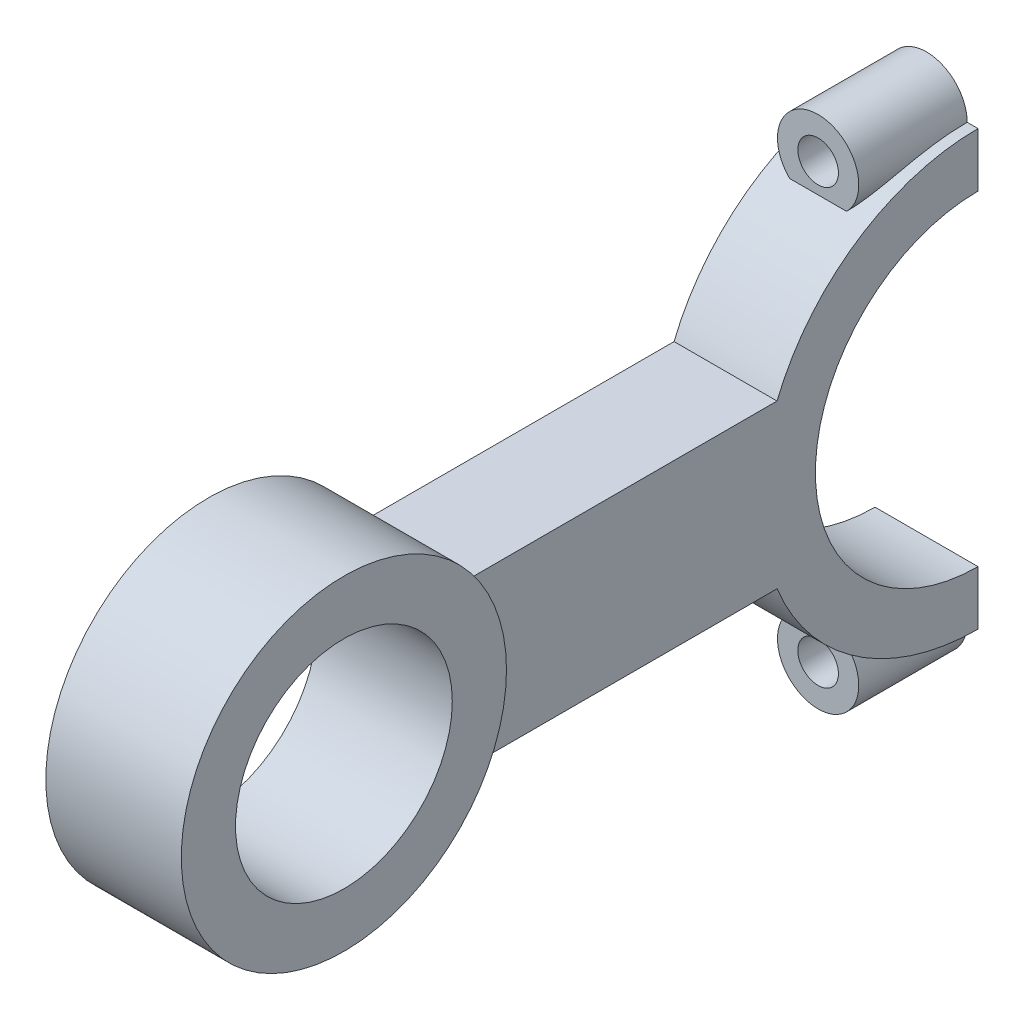
ISO-10303-21;
HEADER;
FILE_DESCRIPTION(('STEP AP214'),'2;1');
FILE_NAME('part.step','',(''),(''),'','','');
FILE_SCHEMA(('AUTOMOTIVE_DESIGN { 1 0 10303 214 1 1 1 1 }'));
ENDSEC;
DATA;
#1=APPLICATION_CONTEXT('core data for automotive mechanical design processes');
#2=APPLICATION_PROTOCOL_DEFINITION('international standard','automotive_design',2000,#1);
#3=PRODUCT_CONTEXT('',#1,'mechanical');
#4=PRODUCT('Part','Part','',(#3));
#5=PRODUCT_RELATED_PRODUCT_CATEGORY('part','',(#4));
#6=PRODUCT_DEFINITION_FORMATION('','',#4);
#7=PRODUCT_DEFINITION_CONTEXT('part definition',#1,'design');
#8=PRODUCT_DEFINITION('design','',#6,#7);
#9=PRODUCT_DEFINITION_SHAPE('','',#8);
#10=(LENGTH_UNIT() NAMED_UNIT(*) SI_UNIT(.MILLI.,.METRE.));
#11=(NAMED_UNIT(*) PLANE_ANGLE_UNIT() SI_UNIT($,.RADIAN.));
#12=(NAMED_UNIT(*) SI_UNIT($,.STERADIAN.) SOLID_ANGLE_UNIT());
#13=UNCERTAINTY_MEASURE_WITH_UNIT(LENGTH_MEASURE(1.E-05),#10,'distance_accuracy_value','');
#14=(GEOMETRIC_REPRESENTATION_CONTEXT(3) GLOBAL_UNCERTAINTY_ASSIGNED_CONTEXT((#13)) GLOBAL_UNIT_ASSIGNED_CONTEXT((#10,
#11,#12)) REPRESENTATION_CONTEXT('',''));
#15=CARTESIAN_POINT('',(0.,0.,0.));
#16=DIRECTION('',(0.,0.,1.));
#17=DIRECTION('',(1.,0.,0.));
#18=AXIS2_PLACEMENT_3D('',#15,#16,#17);
#19=CARTESIAN_POINT('',(-12.065,0.,-76.2));
#20=DIRECTION('',(1.,0.,0.));
#21=DIRECTION('',(0.,0.,-1.));
#22=AXIS2_PLACEMENT_3D('',#19,#20,#21);
#23=CYLINDRICAL_SURFACE('',#22,50.8);
#24=DIRECTION('',(1.,0.,0.));
#25=VECTOR('',#24,1.);
#26=CARTESIAN_POINT('',(-12.065,43.9940905122495,-50.8));
#27=LINE('',#26,#25);
#28=CARTESIAN_POINT('',(6.6637242623437,43.9940905122495,-50.8));
#29=VERTEX_POINT('',#28);
#30=CARTESIAN_POINT('',(-6.6637242623437,43.9940905122495,-50.8));
#31=VERTEX_POINT('',#30);
#32=EDGE_CURVE('E12',#29,#31,#27,.F.);
#33=ORIENTED_EDGE('',*,*,#32,.T.);
#34=CARTESIAN_POINT('',(-6.66372426234371,43.9940905122495,-50.8));
#35=CARTESIAN_POINT('',(-6.78714507767568,44.1149745167094,-51.0093556828712));
#36=CARTESIAN_POINT('',(-6.90404502912758,44.2359679779256,-51.2223943921369));
#37=CARTESIAN_POINT('',(-7.1257852077379,44.4773581537205,-51.6548253243804));
#38=CARTESIAN_POINT('',(-7.23063168210203,44.5977551461968,-51.8742141816521));
#39=CARTESIAN_POINT('',(-7.42910931867264,44.8369460844653,-52.3179626378349));
#40=CARTESIAN_POINT('',(-7.5227695305004,44.9557434387529,-52.5423074860222));
#41=CARTESIAN_POINT('',(-7.70014774552419,45.1915149853282,-52.9958551766107));
#42=CARTESIAN_POINT('',(-7.78386430115753,45.3084889100193,-53.2250587206143));
#43=CARTESIAN_POINT('',(-8.0197946567612,45.6535654213124,-53.9142680776743));
#44=CARTESIAN_POINT('',(-8.15881023504244,45.8783260879772,-54.3805063602118));
#45=CARTESIAN_POINT('',(-8.40748586818554,46.3163385454464,-55.326358197645));
#46=CARTESIAN_POINT('',(-8.51712016710643,46.5295801086097,-55.8059830834195));
#47=CARTESIAN_POINT('',(-8.70745871757883,46.933067806619,-56.7531579241606));
#48=CARTESIAN_POINT('',(-8.789273236757,47.1239224957273,-57.2202286793852));
#49=CARTESIAN_POINT('',(-8.93451213982036,47.4925302736367,-58.1623853328301));
#50=CARTESIAN_POINT('',(-8.99793316349758,47.6702809641214,-58.6374726788042));
#51=CARTESIAN_POINT('',(-9.10962499168931,48.0120473917557,-59.5945300060164));
#52=CARTESIAN_POINT('',(-9.15788910041945,48.1760570352086,-60.076502931038));
#53=CARTESIAN_POINT('',(-9.24201704965379,48.4897810633318,-61.0460971657501));
#54=CARTESIAN_POINT('',(-9.27788159984937,48.6394962657922,-61.5337181505212));
#55=CARTESIAN_POINT('',(-9.33988927945831,48.9255181182804,-62.5179487961996));
#56=CARTESIAN_POINT('',(-9.36594796003964,49.0617011741072,-63.0145995750742));
#57=CARTESIAN_POINT('',(-9.41005995898977,49.3189779931191,-64.012147448693));
#58=CARTESIAN_POINT('',(-9.42811310074599,49.4400714233651,-64.5130446368702));
#59=CARTESIAN_POINT('',(-9.45806110305791,49.6669536523306,-65.518281270121));
#60=CARTESIAN_POINT('',(-9.4699581746091,49.772747935995,-66.0226194133219));
#61=CARTESIAN_POINT('',(-9.48918789388723,49.9689516699838,-67.0343363663388));
#62=CARTESIAN_POINT('',(-9.49652071656466,50.0593617098991,-67.5417150588559));
#63=CARTESIAN_POINT('',(-9.50986522006271,50.2520071997592,-68.727004422185));
#64=CARTESIAN_POINT('',(-9.51464110339692,50.348289468525,-69.4059030482798));
#65=CARTESIAN_POINT('',(-9.52104209639243,50.5132898404504,-70.7670032944107));
#66=CARTESIAN_POINT('',(-9.52266748104739,50.5820103489437,-71.4492046209566));
#67=CARTESIAN_POINT('',(-9.52406672643117,50.6640654462971,-72.4707061876681));
#68=CARTESIAN_POINT('',(-9.52436109091229,50.6878446177566,-72.8091965604011));
#69=CARTESIAN_POINT('',(-9.52475472761422,50.7286164699485,-73.4865901040368));
#70=CARTESIAN_POINT('',(-9.52485400035419,50.7456091687403,-73.8254932738385));
#71=CARTESIAN_POINT('',(-9.52497127884611,50.772801367115,-74.5035950009892));
#72=CARTESIAN_POINT('',(-9.52498927879361,50.7830003814541,-74.8427935777055));
#73=CARTESIAN_POINT('',(-9.52499979869331,50.7965999258104,-75.5213278855254));
#74=CARTESIAN_POINT('',(-9.52499231857819,50.8000004378674,-75.8606636169888));
#75=CARTESIAN_POINT('',(-9.525,50.8,-76.2));
#76=B_SPLINE_CURVE_WITH_KNOTS('',3,(#34,#35,#36,#37,#38,#39,#40,#41,#42,#43,#44,#45,#46,#47,#48,
#49,#50,#51,#52,#53,#54,#55,#56,#57,#58,#59,#60,#61,#62,#63,#64,#65,#66,#67,#68,#69,#70,#71,#72,
#73,#74,#75),.UNSPECIFIED.,.F.,.F.,(4,2,2,2,2,2,2,2,2,2,2,2,2,2,2,2,2,2,2,2,4),(0.,
0.814083169141417,1.62774248594388,2.43924061867581,3.25085674205193,4.85721211195251,
6.46497105778604,7.99779083240933,9.53089045343451,11.064666393555,12.5983545331443,
14.144964021117,15.6916076276054,17.2376953600322,18.7837238263056,20.8402618857306,
22.8966204306049,23.9145385695206,24.9324539996777,25.9504421273934,26.9684329444187),.UNSPECIFIED.);
#77=CARTESIAN_POINT('',(-9.525,50.8,-76.2));
#78=VERTEX_POINT('',#77);
#79=EDGE_CURVE('E136',#31,#78,#76,.T.);
#80=ORIENTED_EDGE('',*,*,#79,.T.);
#81=DIRECTION('',(1.,0.,0.));
#82=VECTOR('',#81,1.);
#83=CARTESIAN_POINT('',(-12.065,50.8,-76.2));
#84=LINE('',#83,#82);
#85=CARTESIAN_POINT('',(-12.065,50.8,-76.2));
#86=VERTEX_POINT('',#85);
#87=EDGE_CURVE('E321',#86,#78,#84,.T.);
#88=ORIENTED_EDGE('',*,*,#87,.F.);
#89=CARTESIAN_POINT('',(-12.065,0.,-76.2));
#90=DIRECTION('',(1.,0.,0.));
#91=DIRECTION('',(0.,0.,-1.));
#92=AXIS2_PLACEMENT_3D('',#89,#90,#91);
#93=CIRCLE('',#92,50.8);
#94=CARTESIAN_POINT('',(-12.065,19.05,-29.1071396069425));
#95=VERTEX_POINT('',#94);
#96=EDGE_CURVE('E289',#86,#95,#93,.T.);
#97=ORIENTED_EDGE('',*,*,#96,.T.);
#98=DIRECTION('',(1.,0.,0.));
#99=VECTOR('',#98,1.);
#100=CARTESIAN_POINT('',(-12.065,19.05,-29.1071396069425));
#101=LINE('',#100,#99);
#102=CARTESIAN_POINT('',(12.065,19.05,-29.1071396069425));
#103=VERTEX_POINT('',#102);
#104=EDGE_CURVE('E319',#95,#103,#101,.T.);
#105=ORIENTED_EDGE('',*,*,#104,.T.);
#106=CARTESIAN_POINT('',(12.065,0.,-76.2));
#107=DIRECTION('',(1.,0.,0.));
#108=DIRECTION('',(0.,0.,-1.));
#109=AXIS2_PLACEMENT_3D('',#106,#107,#108);
#110=CIRCLE('',#109,50.8);
#111=CARTESIAN_POINT('',(12.065,50.8,-76.2));
#112=VERTEX_POINT('',#111);
#113=EDGE_CURVE('E310',#112,#103,#110,.T.);
#114=ORIENTED_EDGE('',*,*,#113,.F.);
#115=CARTESIAN_POINT('',(9.52499999999999,50.8,-76.2));
#116=VERTEX_POINT('',#115);
#117=EDGE_CURVE('E150',#116,#112,#84,.T.);
#118=ORIENTED_EDGE('',*,*,#117,.F.);
#119=CARTESIAN_POINT('',(9.52499999999999,50.8,-76.2));
#120=CARTESIAN_POINT('',(9.5249914548326,50.8000004824258,-75.8514595626229));
#121=CARTESIAN_POINT('',(9.52499977792267,50.7964129772817,-75.50291986414));
#122=CARTESIAN_POINT('',(9.52498806551663,50.7820657728827,-74.8059907540749));
#123=CARTESIAN_POINT('',(9.52496803023518,50.771306127919,-74.4576013413752));
#124=CARTESIAN_POINT('',(9.52483750609108,50.7426180633056,-73.761107554386));
#125=CARTESIAN_POINT('',(9.52472701494879,50.724689462993,-73.4130031875015));
#126=CARTESIAN_POINT('',(9.52428881618815,50.6816720466165,-72.7172404071366));
#127=CARTESIAN_POINT('',(9.52396110690317,50.6565831756156,-72.3695819970984));
#128=CARTESIAN_POINT('',(9.52241144807626,50.5704422013308,-71.3257071400585));
#129=CARTESIAN_POINT('',(9.5206217707491,50.4985881058789,-70.6303497570593));
#130=CARTESIAN_POINT('',(9.51360088435099,50.326255188909,-69.2432391615338));
#131=CARTESIAN_POINT('',(9.50836971955042,50.2257767356166,-68.5514859027603));
#132=CARTESIAN_POINT('',(9.49144029038421,49.9922905515643,-67.1482265243227));
#133=CARTESIAN_POINT('',(9.47951845487131,49.8582522367645,-66.4368937685383));
#134=CARTESIAN_POINT('',(9.44513023053024,49.5599658918375,-65.0208545823479));
#135=CARTESIAN_POINT('',(9.42266418119162,49.3957188344377,-64.3161479393475));
#136=CARTESIAN_POINT('',(9.3623092869805,49.037694390344,-62.915952622556));
#137=CARTESIAN_POINT('',(9.32444204523951,48.8439586044837,-62.2204524401887));
#138=CARTESIAN_POINT('',(9.22728079118382,48.4275220428352,-60.8398295528884));
#139=CARTESIAN_POINT('',(9.16799212777738,48.2048285066468,-60.1547043018025));
#140=CARTESIAN_POINT('',(9.02510667092575,47.745934723844,-58.8385151553116));
#141=CARTESIAN_POINT('',(8.94321096947782,47.5113840419628,-58.2067007028179));
#142=CARTESIAN_POINT('',(8.79568070367291,47.1422542834185,-57.2695801645589));
#143=CARTESIAN_POINT('',(8.74237368582689,47.0162946605612,-56.9588999798175));
#144=CARTESIAN_POINT('',(8.62641533591693,46.7588942926624,-56.3415611892948));
#145=CARTESIAN_POINT('',(8.56376407462319,46.6274535891383,-56.0349025530747));
#146=CARTESIAN_POINT('',(8.42870449128087,46.3610125647959,-55.4297193846938));
#147=CARTESIAN_POINT('',(8.35641807623656,46.226071396028,-55.1311417343201));
#148=CARTESIAN_POINT('',(8.20023603813151,45.9516303419619,-54.5391109893381));
#149=CARTESIAN_POINT('',(8.1163395324352,45.8121301106858,-54.2456582862565));
#150=CARTESIAN_POINT('',(7.93559338158615,45.529314934328,-53.6650124612053));
#151=CARTESIAN_POINT('',(7.83875676593935,45.3860039411109,-53.3778133763629));
#152=CARTESIAN_POINT('',(7.63049223891868,45.0962249143271,-52.8104320433214));
#153=CARTESIAN_POINT('',(7.51906846315709,44.9497577853532,-52.5302478330517));
#154=CARTESIAN_POINT('',(7.34543764390407,44.7355526177639,-52.1294709500981));
#155=CARTESIAN_POINT('',(7.28973037847408,44.6686664087043,-52.0055818586762));
#156=CARTESIAN_POINT('',(7.17480563556864,44.5345720021468,-51.7596337065241));
#157=CARTESIAN_POINT('',(7.11558854012569,44.4673638404216,-51.6375744484285));
#158=CARTESIAN_POINT('',(6.9932430103707,44.3325044255268,-51.3949930059154));
#159=CARTESIAN_POINT('',(6.93010130788377,44.264852447728,-51.2744779055503));
#160=CARTESIAN_POINT('',(6.79989782904159,44.1294812042795,-51.0355851985909));
#161=CARTESIAN_POINT('',(6.73283526957157,44.0617619278614,-50.9172080252282));
#162=CARTESIAN_POINT('',(6.6637242623437,43.9940905122495,-50.8));
#163=B_SPLINE_CURVE_WITH_KNOTS('',3,(#119,#120,#121,#122,#123,#124,#125,#126,#127,#128,#129,
#130,#131,#132,#133,#134,#135,#136,#137,#138,#139,#140,#141,#142,#143,#144,#145,#146,#147,#148,
#149,#150,#151,#152,#153,#154,#155,#156,#157,#158,#159,#160,#161,#162),.UNSPECIFIED.,.F.,.F.,(4,
2,2,2,2,2,2,2,2,2,2,2,2,2,2,2,2,2,2,2,2,4),(0.,1.04560138208973,2.09119484933769,
3.1368146679563,4.18244250928531,6.27897471061054,8.37547994323048,10.5466111894912,
12.7176725371477,14.8856989996193,17.0531844816865,19.0886125964924,20.1068171030802,
21.1250138985169,22.1313728448569,23.1378083398387,24.1432379769158,25.148383179003,
25.602577281186,26.0567220364261,26.5124958249545,26.9683609584797),.UNSPECIFIED.);
#164=EDGE_CURVE('E143',#116,#29,#163,.T.);
#165=ORIENTED_EDGE('',*,*,#164,.T.);
#166=EDGE_LOOP('',(#33,#80,#88,#97,#105,#114,#118,#165));
#167=FACE_BOUND('',#166,.T.);
#168=ADVANCED_FACE('F45',(#167),#23,.T.);
#169=CARTESIAN_POINT('',(-12.065,0.,0.));
#170=DIRECTION('',(1.,0.,0.));
#171=DIRECTION('',(0.,0.,-1.));
#172=AXIS2_PLACEMENT_3D('',#169,#170,#171);
#173=PLANE('',#172);
#174=CARTESIAN_POINT('',(-12.065,0.,76.2));
#175=DIRECTION('',(1.,0.,0.));
#176=DIRECTION('',(0.,0.,-1.));
#177=AXIS2_PLACEMENT_3D('',#174,#175,#176);
#178=CIRCLE('',#177,38.1);
#179=CARTESIAN_POINT('',(-12.065,19.05,43.2044321158129));
#180=VERTEX_POINT('',#179);
#181=CARTESIAN_POINT('',(-12.065,-19.05,43.2044321158129));
#182=VERTEX_POINT('',#181);
#183=EDGE_CURVE('E269',#180,#182,#178,.F.);
#184=ORIENTED_EDGE('',*,*,#183,.F.);
#185=DIRECTION('',(0.,0.,1.));
#186=VECTOR('',#185,1.);
#187=CARTESIAN_POINT('',(-12.065,19.05,0.));
#188=LINE('',#187,#186);
#189=EDGE_CURVE('E292',#95,#180,#188,.T.);
#190=ORIENTED_EDGE('',*,*,#189,.F.);
#191=ORIENTED_EDGE('',*,*,#96,.F.);
#192=DIRECTION('',(0.,-1.,0.));
#193=VECTOR('',#192,1.);
#194=CARTESIAN_POINT('',(-12.065,0.,-76.2));
#195=LINE('',#194,#193);
#196=CARTESIAN_POINT('',(-12.065,38.1,-76.2));
#197=VERTEX_POINT('',#196);
#198=EDGE_CURVE('E286',#86,#197,#195,.T.);
#199=ORIENTED_EDGE('',*,*,#198,.T.);
#200=CARTESIAN_POINT('',(-12.065,0.,-76.2));
#201=DIRECTION('',(1.,0.,0.));
#202=DIRECTION('',(0.,0.,-1.));
#203=AXIS2_PLACEMENT_3D('',#200,#201,#202);
#204=CIRCLE('',#203,38.1);
#205=CARTESIAN_POINT('',(-12.065,-38.1,-76.2));
#206=VERTEX_POINT('',#205);
#207=EDGE_CURVE('E283',#197,#206,#204,.T.);
#208=ORIENTED_EDGE('',*,*,#207,.T.);
#209=DIRECTION('',(0.,-1.,0.));
#210=VECTOR('',#209,1.);
#211=CARTESIAN_POINT('',(-12.065,0.,-76.2));
#212=LINE('',#211,#210);
#213=CARTESIAN_POINT('',(-12.065,-50.8,-76.2));
#214=VERTEX_POINT('',#213);
#215=EDGE_CURVE('E281',#206,#214,#212,.T.);
#216=ORIENTED_EDGE('',*,*,#215,.T.);
#217=CARTESIAN_POINT('',(-12.065,0.,-76.2));
#218=DIRECTION('',(1.,0.,0.));
#219=DIRECTION('',(0.,0.,-1.));
#220=AXIS2_PLACEMENT_3D('',#217,#218,#219);
#221=CIRCLE('',#220,50.8);
#222=CARTESIAN_POINT('',(-12.065,-19.05,-29.1071396069426));
#223=VERTEX_POINT('',#222);
#224=EDGE_CURVE('E277',#223,#214,#221,.T.);
#225=ORIENTED_EDGE('',*,*,#224,.F.);
#226=DIRECTION('',(0.,0.,1.));
#227=VECTOR('',#226,1.);
#228=CARTESIAN_POINT('',(-12.065,-19.05,0.));
#229=LINE('',#228,#227);
#230=EDGE_CURVE('E274',#223,#182,#229,.T.);
#231=ORIENTED_EDGE('',*,*,#230,.T.);
#232=EDGE_LOOP('',(#184,#190,#191,#199,#208,#216,#225,#231));
#233=FACE_BOUND('',#232,.T.);
#234=ADVANCED_FACE('F226',(#233),#173,.F.);
#235=CARTESIAN_POINT('',(12.065,0.,0.));
#236=DIRECTION('',(1.,0.,0.));
#237=DIRECTION('',(0.,0.,-1.));
#238=AXIS2_PLACEMENT_3D('',#235,#236,#237);
#239=PLANE('',#238);
#240=DIRECTION('',(0.,0.,1.));
#241=VECTOR('',#240,1.);
#242=CARTESIAN_POINT('',(12.065,19.05,0.));
#243=LINE('',#242,#241);
#244=CARTESIAN_POINT('',(12.065,19.05,43.2044321158129));
#245=VERTEX_POINT('',#244);
#246=EDGE_CURVE('E278',#103,#245,#243,.T.);
#247=ORIENTED_EDGE('',*,*,#246,.T.);
#248=CARTESIAN_POINT('',(12.065,0.,76.2));
#249=DIRECTION('',(1.,0.,0.));
#250=DIRECTION('',(0.,0.,-1.));
#251=AXIS2_PLACEMENT_3D('',#248,#249,#250);
#252=CIRCLE('',#251,38.1);
#253=CARTESIAN_POINT('',(12.065,-19.05,43.2044321158129));
#254=VERTEX_POINT('',#253);
#255=EDGE_CURVE('E318',#245,#254,#252,.F.);
#256=ORIENTED_EDGE('',*,*,#255,.T.);
#257=DIRECTION('',(0.,0.,1.));
#258=VECTOR('',#257,1.);
#259=CARTESIAN_POINT('',(12.065,-19.05,0.));
#260=LINE('',#259,#258);
#261=CARTESIAN_POINT('',(12.065,-19.05,-29.1071396069426));
#262=VERTEX_POINT('',#261);
#263=EDGE_CURVE('E273',#262,#254,#260,.T.);
#264=ORIENTED_EDGE('',*,*,#263,.F.);
#265=CARTESIAN_POINT('',(12.065,0.,-76.2));
#266=DIRECTION('',(1.,0.,0.));
#267=DIRECTION('',(0.,0.,-1.));
#268=AXIS2_PLACEMENT_3D('',#265,#266,#267);
#269=CIRCLE('',#268,50.8);
#270=CARTESIAN_POINT('',(12.065,-50.8,-76.2));
#271=VERTEX_POINT('',#270);
#272=EDGE_CURVE('E298',#262,#271,#269,.T.);
#273=ORIENTED_EDGE('',*,*,#272,.T.);
#274=DIRECTION('',(0.,-1.,0.));
#275=VECTOR('',#274,1.);
#276=CARTESIAN_POINT('',(12.065,0.,-76.2));
#277=LINE('',#276,#275);
#278=CARTESIAN_POINT('',(12.065,-38.1,-76.2));
#279=VERTEX_POINT('',#278);
#280=EDGE_CURVE('E301',#279,#271,#277,.T.);
#281=ORIENTED_EDGE('',*,*,#280,.F.);
#282=CARTESIAN_POINT('',(12.065,0.,-76.2));
#283=DIRECTION('',(1.,0.,0.));
#284=DIRECTION('',(0.,0.,-1.));
#285=AXIS2_PLACEMENT_3D('',#282,#283,#284);
#286=CIRCLE('',#285,38.1);
#287=CARTESIAN_POINT('',(12.065,38.1,-76.2));
#288=VERTEX_POINT('',#287);
#289=EDGE_CURVE('E304',#288,#279,#286,.T.);
#290=ORIENTED_EDGE('',*,*,#289,.F.);
#291=DIRECTION('',(0.,-1.,0.));
#292=VECTOR('',#291,1.);
#293=CARTESIAN_POINT('',(12.065,0.,-76.2));
#294=LINE('',#293,#292);
#295=EDGE_CURVE('E307',#112,#288,#294,.T.);
#296=ORIENTED_EDGE('',*,*,#295,.F.);
#297=ORIENTED_EDGE('',*,*,#113,.T.);
#298=EDGE_LOOP('',(#247,#256,#264,#273,#281,#290,#296,#297));
#299=FACE_BOUND('',#298,.T.);
#300=ADVANCED_FACE('F218',(#299),#239,.T.);
#301=CARTESIAN_POINT('',(-12.065,0.,76.2));
#302=DIRECTION('',(1.,0.,0.));
#303=DIRECTION('',(0.,0.,-1.));
#304=AXIS2_PLACEMENT_3D('',#301,#302,#303);
#305=CYLINDRICAL_SURFACE('',#304,38.1);
#306=DIRECTION('',(1.,0.,0.));
#307=VECTOR('',#306,1.);
#308=CARTESIAN_POINT('',(-12.065,-19.05,43.2044321158129));
#309=LINE('',#308,#307);
#310=EDGE_CURVE('E295',#182,#254,#309,.T.);
#311=ORIENTED_EDGE('',*,*,#310,.T.);
#312=ORIENTED_EDGE('',*,*,#255,.F.);
#313=DIRECTION('',(1.,0.,0.));
#314=VECTOR('',#313,1.);
#315=CARTESIAN_POINT('',(-12.065,19.05,43.2044321158129));
#316=LINE('',#315,#314);
#317=EDGE_CURVE('E315',#180,#245,#316,.T.);
#318=ORIENTED_EDGE('',*,*,#317,.F.);
#319=ORIENTED_EDGE('',*,*,#183,.T.);
#320=EDGE_LOOP('',(#311,#312,#318,#319));
#321=FACE_BOUND('',#320,.T.);
#322=CARTESIAN_POINT('',(15.875,0.,76.2));
#323=DIRECTION('',(1.,0.,0.));
#324=DIRECTION('',(0.,0.,-1.));
#325=AXIS2_PLACEMENT_3D('',#322,#323,#324);
#326=CIRCLE('',#325,38.1);
#327=CARTESIAN_POINT('',(15.875,0.,38.1));
#328=VERTEX_POINT('',#327);
#329=EDGE_CURVE('E266',#328,#328,#326,.T.);
#330=ORIENTED_EDGE('',*,*,#329,.F.);
#331=EDGE_LOOP('',(#330));
#332=FACE_BOUND('',#331,.T.);
#333=CARTESIAN_POINT('',(-15.875,0.,76.2));
#334=DIRECTION('',(1.,0.,0.));
#335=DIRECTION('',(0.,0.,-1.));
#336=AXIS2_PLACEMENT_3D('',#333,#334,#335);
#337=CIRCLE('',#336,38.1);
#338=CARTESIAN_POINT('',(-15.875,0.,38.1));
#339=VERTEX_POINT('',#338);
#340=EDGE_CURVE('E251',#339,#339,#337,.T.);
#341=ORIENTED_EDGE('',*,*,#340,.T.);
#342=EDGE_LOOP('',(#341));
#343=FACE_BOUND('',#342,.T.);
#344=ADVANCED_FACE('F215',(#321,#332,#343),#305,.T.);
#345=CARTESIAN_POINT('',(-12.065,19.05,0.));
#346=DIRECTION('',(0.,1.,0.));
#347=DIRECTION('',(0.,0.,1.));
#348=AXIS2_PLACEMENT_3D('',#345,#346,#347);
#349=PLANE('',#348);
#350=ORIENTED_EDGE('',*,*,#246,.F.);
#351=ORIENTED_EDGE('',*,*,#104,.F.);
#352=ORIENTED_EDGE('',*,*,#189,.T.);
#353=ORIENTED_EDGE('',*,*,#317,.T.);
#354=EDGE_LOOP('',(#350,#351,#352,#353));
#355=FACE_BOUND('',#354,.T.);
#356=ADVANCED_FACE('F217',(#355),#349,.T.);
#357=CARTESIAN_POINT('',(-12.065,0.,-76.2));
#358=DIRECTION('',(0.,0.,1.));
#359=DIRECTION('',(1.,0.,0.));
#360=AXIS2_PLACEMENT_3D('',#357,#358,#359);
#361=PLANE('',#360);
#362=CARTESIAN_POINT('',(0.,50.8,-76.2));
#363=DIRECTION('',(0.,0.,1.));
#364=DIRECTION('',(-1.,0.,0.));
#365=AXIS2_PLACEMENT_3D('',#362,#363,#364);
#366=CIRCLE('',#365,4.76);
#367=CARTESIAN_POINT('',(-4.76,50.8,-76.2));
#368=VERTEX_POINT('',#367);
#369=EDGE_CURVE('E373',#368,#368,#366,.T.);
#370=ORIENTED_EDGE('',*,*,#369,.T.);
#371=EDGE_LOOP('',(#370));
#372=FACE_BOUND('',#371,.T.);
#373=ORIENTED_EDGE('',*,*,#87,.T.);
#374=CARTESIAN_POINT('',(0.,50.8,-76.2));
#375=DIRECTION('',(0.,0.,1.));
#376=DIRECTION('',(-1.,0.,0.));
#377=AXIS2_PLACEMENT_3D('',#374,#375,#376);
#378=CIRCLE('',#377,9.525);
#379=EDGE_CURVE('E61',#116,#78,#378,.T.);
#380=ORIENTED_EDGE('',*,*,#379,.F.);
#381=ORIENTED_EDGE('',*,*,#117,.T.);
#382=ORIENTED_EDGE('',*,*,#295,.T.);
#383=DIRECTION('',(1.,0.,0.));
#384=VECTOR('',#383,1.);
#385=CARTESIAN_POINT('',(-12.065,38.1,-76.2));
#386=LINE('',#385,#384);
#387=EDGE_CURVE('E323',#197,#288,#386,.T.);
#388=ORIENTED_EDGE('',*,*,#387,.F.);
#389=ORIENTED_EDGE('',*,*,#198,.F.);
#390=EDGE_LOOP('',(#373,#380,#381,#382,#388,#389));
#391=FACE_BOUND('',#390,.T.);
#392=ADVANCED_FACE('F224',(#372,#391),#361,.F.);
#393=CARTESIAN_POINT('',(-12.065,0.,-76.2));
#394=DIRECTION('',(1.,0.,0.));
#395=DIRECTION('',(0.,0.,-1.));
#396=AXIS2_PLACEMENT_3D('',#393,#394,#395);
#397=CYLINDRICAL_SURFACE('',#396,38.1);
#398=ORIENTED_EDGE('',*,*,#289,.T.);
#399=DIRECTION('',(1.,0.,0.));
#400=VECTOR('',#399,1.);
#401=CARTESIAN_POINT('',(-12.065,-38.1,-76.2));
#402=LINE('',#401,#400);
#403=EDGE_CURVE('E326',#206,#279,#402,.T.);
#404=ORIENTED_EDGE('',*,*,#403,.F.);
#405=ORIENTED_EDGE('',*,*,#207,.F.);
#406=ORIENTED_EDGE('',*,*,#387,.T.);
#407=EDGE_LOOP('',(#398,#404,#405,#406));
#408=FACE_BOUND('',#407,.T.);
#409=ADVANCED_FACE('F347',(#408),#397,.F.);
#410=CARTESIAN_POINT('',(-12.065,0.,-76.2));
#411=DIRECTION('',(0.,0.,1.));
#412=DIRECTION('',(1.,0.,0.));
#413=AXIS2_PLACEMENT_3D('',#410,#411,#412);
#414=PLANE('',#413);
#415=CARTESIAN_POINT('',(0.,-50.8,-76.2));
#416=DIRECTION('',(0.,0.,-1.));
#417=DIRECTION('',(-1.,0.,0.));
#418=AXIS2_PLACEMENT_3D('',#415,#416,#417);
#419=CIRCLE('',#418,4.76);
#420=CARTESIAN_POINT('',(-4.76,-50.8,-76.2));
#421=VERTEX_POINT('',#420);
#422=EDGE_CURVE('E142',#421,#421,#419,.T.);
#423=ORIENTED_EDGE('',*,*,#422,.F.);
#424=EDGE_LOOP('',(#423));
#425=FACE_BOUND('',#424,.T.);
#426=DIRECTION('',(1.,0.,0.));
#427=VECTOR('',#426,1.);
#428=CARTESIAN_POINT('',(-12.065,-50.8,-76.2));
#429=LINE('',#428,#427);
#430=CARTESIAN_POINT('',(9.52499999999999,-50.8,-76.2));
#431=VERTEX_POINT('',#430);
#432=EDGE_CURVE('E331',#431,#271,#429,.T.);
#433=ORIENTED_EDGE('',*,*,#432,.F.);
#434=CARTESIAN_POINT('',(0.,-50.8,-76.2));
#435=DIRECTION('',(0.,0.,-1.));
#436=DIRECTION('',(-1.,0.,0.));
#437=AXIS2_PLACEMENT_3D('',#434,#435,#436);
#438=CIRCLE('',#437,9.525);
#439=CARTESIAN_POINT('',(-9.525,-50.8,-76.2));
#440=VERTEX_POINT('',#439);
#441=EDGE_CURVE('E262',#431,#440,#438,.T.);
#442=ORIENTED_EDGE('',*,*,#441,.T.);
#443=EDGE_CURVE('E329',#214,#440,#429,.T.);
#444=ORIENTED_EDGE('',*,*,#443,.F.);
#445=ORIENTED_EDGE('',*,*,#215,.F.);
#446=ORIENTED_EDGE('',*,*,#403,.T.);
#447=ORIENTED_EDGE('',*,*,#280,.T.);
#448=EDGE_LOOP('',(#433,#442,#444,#445,#446,#447));
#449=FACE_BOUND('',#448,.T.);
#450=ADVANCED_FACE('F210',(#425,#449),#414,.F.);
#451=CARTESIAN_POINT('',(-12.065,0.,-76.2));
#452=DIRECTION('',(1.,0.,0.));
#453=DIRECTION('',(0.,0.,-1.));
#454=AXIS2_PLACEMENT_3D('',#451,#452,#453);
#455=CYLINDRICAL_SURFACE('',#454,50.8);
#456=CARTESIAN_POINT('',(9.525,-50.8,-76.2));
#457=CARTESIAN_POINT('',(9.52499145483261,-50.8000004824257,-75.8514595626229));
#458=CARTESIAN_POINT('',(9.52499977792267,-50.7964129772816,-75.5029198641399));
#459=CARTESIAN_POINT('',(9.52498806551663,-50.7820657728826,-74.8059907540749));
#460=CARTESIAN_POINT('',(9.52496803023518,-50.7713061279189,-74.4576013413752));
#461=CARTESIAN_POINT('',(9.52483750609108,-50.7426180633055,-73.761107554386));
#462=CARTESIAN_POINT('',(9.52472701494879,-50.7246894629929,-73.4130031875014));
#463=CARTESIAN_POINT('',(9.52428881618815,-50.6816720466164,-72.7172404071365));
#464=CARTESIAN_POINT('',(9.52396110690317,-50.6565831756155,-72.3695819970984));
#465=CARTESIAN_POINT('',(9.52241144807626,-50.5704422013307,-71.3257071400585));
#466=CARTESIAN_POINT('',(9.5206217707491,-50.4985881058788,-70.6303497570593));
#467=CARTESIAN_POINT('',(9.51360088435099,-50.326255188909,-69.2432391615338));
#468=CARTESIAN_POINT('',(9.50836971955041,-50.2257767356165,-68.5514859027603));
#469=CARTESIAN_POINT('',(9.4914402903842,-49.9922905515643,-67.1482265243227));
#470=CARTESIAN_POINT('',(9.47951845487131,-49.8582522367644,-66.4368937685383));
#471=CARTESIAN_POINT('',(9.44513023053023,-49.5599658918375,-65.0208545823479));
#472=CARTESIAN_POINT('',(9.42266418119161,-49.3957188344376,-64.3161479393475));
#473=CARTESIAN_POINT('',(9.36230928698049,-49.0376943903439,-62.9159526225561));
#474=CARTESIAN_POINT('',(9.3244420452395,-48.8439586044837,-62.2204524401887));
#475=CARTESIAN_POINT('',(9.22728079118381,-48.4275220428351,-60.8398295528884));
#476=CARTESIAN_POINT('',(9.16799212777737,-48.2048285066467,-60.1547043018025));
#477=CARTESIAN_POINT('',(9.02510667092573,-47.745934723844,-58.8385151553117));
#478=CARTESIAN_POINT('',(8.9432109694778,-47.5113840419627,-58.206700702818));
#479=CARTESIAN_POINT('',(8.79568070367289,-47.1422542834185,-57.269580164559));
#480=CARTESIAN_POINT('',(8.74237368582688,-47.0162946605611,-56.9588999798176));
#481=CARTESIAN_POINT('',(8.62641533591692,-46.7588942926624,-56.3415611892948));
#482=CARTESIAN_POINT('',(8.56376407462317,-46.6274535891383,-56.0349025530748));
#483=CARTESIAN_POINT('',(8.42870449128085,-46.3610125647959,-55.4297193846939));
#484=CARTESIAN_POINT('',(8.35641807623655,-46.226071396028,-55.1311417343202));
#485=CARTESIAN_POINT('',(8.20023603813151,-45.9516303419619,-54.5391109893382));
#486=CARTESIAN_POINT('',(8.11633953243519,-45.8121301106858,-54.2456582862566));
#487=CARTESIAN_POINT('',(7.93559338158614,-45.529314934328,-53.6650124612054));
#488=CARTESIAN_POINT('',(7.83875676593934,-45.3860039411109,-53.3778133763629));
#489=CARTESIAN_POINT('',(7.63049223891867,-45.0962249143271,-52.8104320433215));
#490=CARTESIAN_POINT('',(7.51906846315708,-44.9497577853532,-52.5302478330518));
#491=CARTESIAN_POINT('',(7.34543764390405,-44.7355526177639,-52.1294709500982));
#492=CARTESIAN_POINT('',(7.28973037847407,-44.6686664087043,-52.0055818586763));
#493=CARTESIAN_POINT('',(7.17480563556863,-44.5345720021468,-51.7596337065242));
#494=CARTESIAN_POINT('',(7.11558854012566,-44.4673638404216,-51.6375744484286));
#495=CARTESIAN_POINT('',(6.99324301037067,-44.3325044255268,-51.3949930059155));
#496=CARTESIAN_POINT('',(6.93010130788373,-44.264852447728,-51.2744779055504));
#497=CARTESIAN_POINT('',(6.79989782904154,-44.1294812042794,-51.0355851985909));
#498=CARTESIAN_POINT('',(6.73283526957152,-44.0617619278614,-50.9172080252282));
#499=CARTESIAN_POINT('',(6.66372426234365,-43.9940905122495,-50.8));
#500=B_SPLINE_CURVE_WITH_KNOTS('',3,(#456,#457,#458,#459,#460,#461,#462,#463,#464,#465,#466,
#467,#468,#469,#470,#471,#472,#473,#474,#475,#476,#477,#478,#479,#480,#481,#482,#483,#484,#485,
#486,#487,#488,#489,#490,#491,#492,#493,#494,#495,#496,#497,#498,#499),.UNSPECIFIED.,.F.,.F.,(4,
2,2,2,2,2,2,2,2,2,2,2,2,2,2,2,2,2,2,2,2,4),(0.,1.04560138208973,2.09119484933769,
3.13681466795631,4.18244250928531,6.27897471061053,8.37547994323046,10.5466111894911,
12.7176725371477,14.8856989996193,17.0531844816865,19.0886125964924,20.1068171030801,
21.1250138985168,22.1313728448568,23.1378083398386,24.1432379769157,25.1483831790028,
25.6025772811859,26.056722036426,26.5124958249544,26.9683609584797),.UNSPECIFIED.);
#501=CARTESIAN_POINT('',(6.66372426234364,-43.9940905122494,-50.8));
#502=VERTEX_POINT('',#501);
#503=EDGE_CURVE('E54',#431,#502,#500,.T.);
#504=ORIENTED_EDGE('',*,*,#503,.F.);
#505=ORIENTED_EDGE('',*,*,#432,.T.);
#506=ORIENTED_EDGE('',*,*,#272,.F.);
#507=DIRECTION('',(1.,0.,0.));
#508=VECTOR('',#507,1.);
#509=CARTESIAN_POINT('',(-12.065,-19.05,-29.1071396069426));
#510=LINE('',#509,#508);
#511=EDGE_CURVE('E332',#223,#262,#510,.T.);
#512=ORIENTED_EDGE('',*,*,#511,.F.);
#513=ORIENTED_EDGE('',*,*,#224,.T.);
#514=ORIENTED_EDGE('',*,*,#443,.T.);
#515=CARTESIAN_POINT('',(-6.66372426234365,-43.9940905122494,-50.8));
#516=CARTESIAN_POINT('',(-6.78714507767562,-44.1149745167093,-51.0093556828712));
#517=CARTESIAN_POINT('',(-6.90404502912752,-44.2359679779255,-51.2223943921369));
#518=CARTESIAN_POINT('',(-7.12578520773784,-44.4773581537204,-51.6548253243804));
#519=CARTESIAN_POINT('',(-7.23063168210197,-44.5977551461967,-51.8742141816521));
#520=CARTESIAN_POINT('',(-7.42910931867259,-44.8369460844652,-52.3179626378348));
#521=CARTESIAN_POINT('',(-7.52276953050035,-44.9557434387528,-52.5423074860221));
#522=CARTESIAN_POINT('',(-7.70014774552414,-45.1915149853282,-52.9958551766106));
#523=CARTESIAN_POINT('',(-7.78386430115748,-45.3084889100193,-53.2250587206143));
#524=CARTESIAN_POINT('',(-8.01979465676115,-45.6535654213124,-53.9142680776742));
#525=CARTESIAN_POINT('',(-8.15881023504239,-45.8783260879771,-54.3805063602118));
#526=CARTESIAN_POINT('',(-8.4074858681855,-46.3163385454463,-55.3263581976449));
#527=CARTESIAN_POINT('',(-8.51712016710639,-46.5295801086096,-55.8059830834195));
#528=CARTESIAN_POINT('',(-8.70745871757879,-46.9330678066189,-56.7531579241606));
#529=CARTESIAN_POINT('',(-8.78927323675696,-47.1239224957272,-57.2202286793852));
#530=CARTESIAN_POINT('',(-8.93451213982032,-47.4925302736366,-58.16238533283));
#531=CARTESIAN_POINT('',(-8.99793316349754,-47.6702809641213,-58.6374726788041));
#532=CARTESIAN_POINT('',(-9.10962499168928,-48.0120473917556,-59.5945300060163));
#533=CARTESIAN_POINT('',(-9.15788910041942,-48.1760570352085,-60.0765029310378));
#534=CARTESIAN_POINT('',(-9.24201704965377,-48.4897810633317,-61.0460971657499));
#535=CARTESIAN_POINT('',(-9.27788159984935,-48.6394962657921,-61.533718150521));
#536=CARTESIAN_POINT('',(-9.33988927945829,-48.9255181182803,-62.5179487961995));
#537=CARTESIAN_POINT('',(-9.36594796003962,-49.0617011741071,-63.014599575074));
#538=CARTESIAN_POINT('',(-9.41005995898975,-49.318977993119,-64.0121474486929));
#539=CARTESIAN_POINT('',(-9.42811310074597,-49.440071423365,-64.51304463687));
#540=CARTESIAN_POINT('',(-9.4580611030579,-49.6669536523305,-65.5182812701208));
#541=CARTESIAN_POINT('',(-9.46995817460909,-49.7727479359949,-66.0226194133217));
#542=CARTESIAN_POINT('',(-9.48918789388722,-49.9689516699837,-67.0343363663386));
#543=CARTESIAN_POINT('',(-9.49652071656465,-50.059361709899,-67.5417150588556));
#544=CARTESIAN_POINT('',(-9.50986522006271,-50.2520071997591,-68.7270044221848));
#545=CARTESIAN_POINT('',(-9.51464110339691,-50.3482894685249,-69.4059030482796));
#546=CARTESIAN_POINT('',(-9.52104209639243,-50.5132898404503,-70.7670032944105));
#547=CARTESIAN_POINT('',(-9.52266748104738,-50.5820103489436,-71.4492046209565));
#548=CARTESIAN_POINT('',(-9.52406672643117,-50.6640654462971,-72.470706187668));
#549=CARTESIAN_POINT('',(-9.52436109091229,-50.6878446177565,-72.809196560401));
#550=CARTESIAN_POINT('',(-9.52475472761422,-50.7286164699485,-73.4865901040367));
#551=CARTESIAN_POINT('',(-9.52485400035419,-50.7456091687402,-73.8254932738385));
#552=CARTESIAN_POINT('',(-9.52497127884611,-50.7728013671149,-74.5035950009892));
#553=CARTESIAN_POINT('',(-9.52498927879361,-50.783000381454,-74.8427935777055));
#554=CARTESIAN_POINT('',(-9.52499979869331,-50.7965999258103,-75.5213278855254));
#555=CARTESIAN_POINT('',(-9.52499231857819,-50.8000004378673,-75.8606636169888));
#556=CARTESIAN_POINT('',(-9.525,-50.8,-76.2));
#557=B_SPLINE_CURVE_WITH_KNOTS('',3,(#515,#516,#517,#518,#519,#520,#521,#522,#523,#524,#525,
#526,#527,#528,#529,#530,#531,#532,#533,#534,#535,#536,#537,#538,#539,#540,#541,#542,#543,#544,
#545,#546,#547,#548,#549,#550,#551,#552,#553,#554,#555,#556),.UNSPECIFIED.,.F.,.F.,(4,2,2,2,2,2,
2,2,2,2,2,2,2,2,2,2,2,2,2,2,4),(0.,0.814083169141413,1.62774248594387,2.43924061867579,
3.25085674205189,4.85721211195247,6.46497105778597,7.99779083240924,9.53089045343441,
11.0646663935549,12.5983545331441,14.1449640211168,15.6916076276052,17.237695360032,
18.7837238263054,20.8402618857304,22.8966204306048,23.9145385695205,24.9324539996776,
25.9504421273934,26.9684329444187),.UNSPECIFIED.);
#558=CARTESIAN_POINT('',(-6.66372426234365,-43.9940905122494,-50.8));
#559=VERTEX_POINT('',#558);
#560=EDGE_CURVE('E190',#559,#440,#557,.T.);
#561=ORIENTED_EDGE('',*,*,#560,.F.);
#562=DIRECTION('',(1.,0.,0.));
#563=VECTOR('',#562,1.);
#564=CARTESIAN_POINT('',(-12.065,-43.9940905122494,-50.8));
#565=LINE('',#564,#563);
#566=EDGE_CURVE('E69',#559,#502,#565,.T.);
#567=ORIENTED_EDGE('',*,*,#566,.T.);
#568=EDGE_LOOP('',(#504,#505,#506,#512,#513,#514,#561,#567));
#569=FACE_BOUND('',#568,.T.);
#570=ADVANCED_FACE('F204',(#569),#455,.T.);
#571=CARTESIAN_POINT('',(-12.065,-19.05,0.));
#572=DIRECTION('',(0.,1.,0.));
#573=DIRECTION('',(0.,0.,1.));
#574=AXIS2_PLACEMENT_3D('',#571,#572,#573);
#575=PLANE('',#574);
#576=ORIENTED_EDGE('',*,*,#263,.T.);
#577=ORIENTED_EDGE('',*,*,#310,.F.);
#578=ORIENTED_EDGE('',*,*,#230,.F.);
#579=ORIENTED_EDGE('',*,*,#511,.T.);
#580=EDGE_LOOP('',(#576,#577,#578,#579));
#581=FACE_BOUND('',#580,.T.);
#582=ADVANCED_FACE('F209',(#581),#575,.F.);
#583=CARTESIAN_POINT('',(15.875,0.,76.2));
#584=DIRECTION('',(1.,0.,0.));
#585=DIRECTION('',(0.,0.,-1.));
#586=AXIS2_PLACEMENT_3D('',#583,#584,#585);
#587=PLANE('',#586);
#588=ORIENTED_EDGE('',*,*,#329,.T.);
#589=EDGE_LOOP('',(#588));
#590=FACE_BOUND('',#589,.T.);
#591=CARTESIAN_POINT('',(15.875,0.,76.2));
#592=DIRECTION('',(1.,0.,0.));
#593=DIRECTION('',(0.,0.,-1.));
#594=AXIS2_PLACEMENT_3D('',#591,#592,#593);
#595=CIRCLE('',#594,25.4);
#596=CARTESIAN_POINT('',(15.875,0.,50.8));
#597=VERTEX_POINT('',#596);
#598=EDGE_CURVE('E256',#597,#597,#595,.T.);
#599=ORIENTED_EDGE('',*,*,#598,.F.);
#600=EDGE_LOOP('',(#599));
#601=FACE_BOUND('',#600,.T.);
#602=ADVANCED_FACE('F186',(#590,#601),#587,.T.);
#603=CARTESIAN_POINT('',(-15.875,0.,76.2));
#604=DIRECTION('',(1.,0.,0.));
#605=DIRECTION('',(0.,0.,-1.));
#606=AXIS2_PLACEMENT_3D('',#603,#604,#605);
#607=PLANE('',#606);
#608=ORIENTED_EDGE('',*,*,#340,.F.);
#609=EDGE_LOOP('',(#608));
#610=FACE_BOUND('',#609,.T.);
#611=CARTESIAN_POINT('',(-15.875,0.,76.2));
#612=DIRECTION('',(1.,0.,0.));
#613=DIRECTION('',(0.,0.,-1.));
#614=AXIS2_PLACEMENT_3D('',#611,#612,#613);
#615=CIRCLE('',#614,25.4);
#616=CARTESIAN_POINT('',(-15.875,0.,50.8));
#617=VERTEX_POINT('',#616);
#618=EDGE_CURVE('E254',#617,#617,#615,.T.);
#619=ORIENTED_EDGE('',*,*,#618,.T.);
#620=EDGE_LOOP('',(#619));
#621=FACE_BOUND('',#620,.T.);
#622=ADVANCED_FACE('F239',(#610,#621),#607,.F.);
#623=CARTESIAN_POINT('',(-12.065,0.,76.2));
#624=DIRECTION('',(1.,0.,0.));
#625=DIRECTION('',(0.,0.,-1.));
#626=AXIS2_PLACEMENT_3D('',#623,#624,#625);
#627=CYLINDRICAL_SURFACE('',#626,25.4);
#628=CARTESIAN_POINT('',(15.875,0.,50.8));
#629=CARTESIAN_POINT('',(15.5442708333333,0.,50.8));
#630=CARTESIAN_POINT('',(15.2135416666667,0.,50.8));
#631=CARTESIAN_POINT('',(14.5520833333333,0.,50.8));
#632=CARTESIAN_POINT('',(14.2213541666667,0.,50.8));
#633=CARTESIAN_POINT('',(13.5598958333333,0.,50.8));
#634=CARTESIAN_POINT('',(13.2291666666667,0.,50.8));
#635=CARTESIAN_POINT('',(12.5677083333333,0.,50.8));
#636=CARTESIAN_POINT('',(12.2369791666667,0.,50.8));
#637=CARTESIAN_POINT('',(11.5755208333333,0.,50.8));
#638=CARTESIAN_POINT('',(11.2447916666667,0.,50.8));
#639=CARTESIAN_POINT('',(10.5833333333333,0.,50.8));
#640=CARTESIAN_POINT('',(10.2526041666667,0.,50.8));
#641=CARTESIAN_POINT('',(9.59114583333333,0.,50.8));
#642=CARTESIAN_POINT('',(9.26041666666666,0.,50.8));
#643=CARTESIAN_POINT('',(8.59895833333333,0.,50.8));
#644=CARTESIAN_POINT('',(8.26822916666666,0.,50.8));
#645=CARTESIAN_POINT('',(7.60677083333333,0.,50.8));
#646=CARTESIAN_POINT('',(7.27604166666666,0.,50.8));
#647=CARTESIAN_POINT('',(6.61458333333333,0.,50.8));
#648=CARTESIAN_POINT('',(6.28385416666666,0.,50.8));
#649=CARTESIAN_POINT('',(5.62239583333333,0.,50.8));
#650=CARTESIAN_POINT('',(5.29166666666666,0.,50.8));
#651=CARTESIAN_POINT('',(4.63020833333333,0.,50.8));
#652=CARTESIAN_POINT('',(4.29947916666666,0.,50.8));
#653=CARTESIAN_POINT('',(3.63802083333333,0.,50.8));
#654=CARTESIAN_POINT('',(3.30729166666666,0.,50.8));
#655=CARTESIAN_POINT('',(2.64583333333333,0.,50.8));
#656=CARTESIAN_POINT('',(2.31510416666667,0.,50.8));
#657=CARTESIAN_POINT('',(1.65364583333333,0.,50.8));
#658=CARTESIAN_POINT('',(1.32291666666666,0.,50.8));
#659=CARTESIAN_POINT('',(0.661458333333332,0.,50.8));
#660=CARTESIAN_POINT('',(0.330729166666665,0.,50.8));
#661=CARTESIAN_POINT('',(-0.330729166666668,0.,50.8));
#662=CARTESIAN_POINT('',(-0.661458333333334,0.,50.8));
#663=CARTESIAN_POINT('',(-1.32291666666667,0.,50.8));
#664=CARTESIAN_POINT('',(-1.65364583333333,0.,50.8));
#665=CARTESIAN_POINT('',(-2.31510416666667,0.,50.8));
#666=CARTESIAN_POINT('',(-2.64583333333334,0.,50.8));
#667=CARTESIAN_POINT('',(-3.30729166666667,0.,50.8));
#668=CARTESIAN_POINT('',(-3.63802083333334,0.,50.8));
#669=CARTESIAN_POINT('',(-4.29947916666667,0.,50.8));
#670=CARTESIAN_POINT('',(-4.63020833333333,0.,50.8));
#671=CARTESIAN_POINT('',(-5.29166666666667,0.,50.8));
#672=CARTESIAN_POINT('',(-5.62239583333333,0.,50.8));
#673=CARTESIAN_POINT('',(-6.28385416666667,0.,50.8));
#674=CARTESIAN_POINT('',(-6.61458333333333,0.,50.8));
#675=CARTESIAN_POINT('',(-7.27604166666667,0.,50.8));
#676=CARTESIAN_POINT('',(-7.60677083333333,0.,50.8));
#677=CARTESIAN_POINT('',(-8.26822916666667,0.,50.8));
#678=CARTESIAN_POINT('',(-8.59895833333333,0.,50.8));
#679=CARTESIAN_POINT('',(-9.26041666666666,0.,50.8));
#680=CARTESIAN_POINT('',(-9.59114583333333,0.,50.8));
#681=CARTESIAN_POINT('',(-10.2526041666667,0.,50.8));
#682=CARTESIAN_POINT('',(-10.5833333333333,0.,50.8));
#683=CARTESIAN_POINT('',(-11.2447916666667,0.,50.8));
#684=CARTESIAN_POINT('',(-11.5755208333333,0.,50.8));
#685=CARTESIAN_POINT('',(-12.2369791666667,0.,50.8));
#686=CARTESIAN_POINT('',(-12.5677083333333,0.,50.8));
#687=CARTESIAN_POINT('',(-13.2291666666667,0.,50.8));
#688=CARTESIAN_POINT('',(-13.5598958333333,0.,50.8));
#689=CARTESIAN_POINT('',(-14.2213541666667,0.,50.8));
#690=CARTESIAN_POINT('',(-14.5520833333333,0.,50.8));
#691=CARTESIAN_POINT('',(-15.2135416666667,0.,50.8));
#692=CARTESIAN_POINT('',(-15.5442708333333,0.,50.8));
#693=CARTESIAN_POINT('',(-15.875,0.,50.8));
#694=B_SPLINE_CURVE_WITH_KNOTS('',3,(#628,#629,#630,#631,#632,#633,#634,#635,#636,#637,#638,
#639,#640,#641,#642,#643,#644,#645,#646,#647,#648,#649,#650,#651,#652,#653,#654,#655,#656,#657,
#658,#659,#660,#661,#662,#663,#664,#665,#666,#667,#668,#669,#670,#671,#672,#673,#674,#675,#676,
#677,#678,#679,#680,#681,#682,#683,#684,#685,#686,#687,#688,#689,#690,#691,#692,#693),
.UNSPECIFIED.,.F.,.F.,(4,2,2,2,2,2,2,2,2,2,2,2,2,2,2,2,2,2,2,2,2,2,2,2,2,2,2,2,2,2,2,2,4),(0.,
0.992187499999998,1.984375,2.9765625,3.96875,4.9609375,5.953125,6.9453125,7.9375,8.9296875,
9.921875,10.9140625,11.90625,12.8984375,13.890625,14.8828125,15.875,16.8671875,17.859375,
18.8515625,19.84375,20.8359375,21.828125,22.8203125,23.8125,24.8046875,25.796875,26.7890625,
27.78125,28.7734375,29.765625,30.7578125,31.75),.UNSPECIFIED.);
#695=EDGE_CURVE('BSEAM47',#597,#617,#694,.T.);
#696=ORIENTED_EDGE('',*,*,#598,.T.);
#697=ORIENTED_EDGE('',*,*,#618,.F.);
#698=ORIENTED_EDGE('',*,*,#695,.T.);
#699=ORIENTED_EDGE('',*,*,#695,.F.);
#700=EDGE_LOOP('',(#696,#698,#697,#699));
#701=FACE_BOUND('',#700,.T.);
#702=ADVANCED_FACE('F47',(#701),#627,.F.);
#703=CARTESIAN_POINT('',(0.,-50.8,-50.8));
#704=DIRECTION('',(0.,0.,-1.));
#705=DIRECTION('',(-1.,0.,0.));
#706=AXIS2_PLACEMENT_3D('',#703,#704,#705);
#707=CYLINDRICAL_SURFACE('',#706,9.525);
#708=ORIENTED_EDGE('',*,*,#441,.F.);
#709=ORIENTED_EDGE('',*,*,#503,.T.);
#710=CARTESIAN_POINT('',(0.,-50.8,-50.8));
#711=DIRECTION('',(0.,0.,-1.));
#712=DIRECTION('',(-1.,0.,0.));
#713=AXIS2_PLACEMENT_3D('',#710,#711,#712);
#714=CIRCLE('',#713,9.525);
#715=EDGE_CURVE('E257',#502,#559,#714,.T.);
#716=ORIENTED_EDGE('',*,*,#715,.T.);
#717=ORIENTED_EDGE('',*,*,#560,.T.);
#718=EDGE_LOOP('',(#708,#709,#716,#717));
#719=FACE_BOUND('',#718,.T.);
#720=ADVANCED_FACE('F180',(#719),#707,.T.);
#721=CARTESIAN_POINT('',(0.,-50.8,-50.8));
#722=DIRECTION('',(0.,0.,-1.));
#723=DIRECTION('',(-1.,0.,0.));
#724=AXIS2_PLACEMENT_3D('',#721,#722,#723);
#725=PLANE('',#724);
#726=CARTESIAN_POINT('',(0.,-50.8,-50.8));
#727=DIRECTION('',(0.,0.,-1.));
#728=DIRECTION('',(-1.,0.,0.));
#729=AXIS2_PLACEMENT_3D('',#726,#727,#728);
#730=CIRCLE('',#729,4.76);
#731=CARTESIAN_POINT('',(-4.76,-50.8,-50.8));
#732=VERTEX_POINT('',#731);
#733=EDGE_CURVE('E203',#732,#732,#730,.T.);
#734=ORIENTED_EDGE('',*,*,#733,.T.);
#735=EDGE_LOOP('',(#734));
#736=FACE_BOUND('',#735,.T.);
#737=ORIENTED_EDGE('',*,*,#566,.F.);
#738=ORIENTED_EDGE('',*,*,#715,.F.);
#739=EDGE_LOOP('',(#737,#738));
#740=FACE_BOUND('',#739,.T.);
#741=ADVANCED_FACE('F176',(#736,#740),#725,.F.);
#742=CARTESIAN_POINT('',(0.,-50.8,-43.8));
#743=DIRECTION('',(0.,0.,-1.));
#744=DIRECTION('',(-1.,0.,0.));
#745=AXIS2_PLACEMENT_3D('',#742,#743,#744);
#746=CYLINDRICAL_SURFACE('',#745,4.76);
#747=ORIENTED_EDGE('',*,*,#422,.T.);
#748=EDGE_LOOP('',(#747));
#749=FACE_BOUND('',#748,.T.);
#750=ORIENTED_EDGE('',*,*,#733,.F.);
#751=EDGE_LOOP('',(#750));
#752=FACE_BOUND('',#751,.T.);
#753=ADVANCED_FACE('F171',(#749,#752),#746,.F.);
#754=CARTESIAN_POINT('',(0.,50.8,-50.8));
#755=DIRECTION('',(0.,0.,-1.));
#756=DIRECTION('',(-1.,0.,0.));
#757=AXIS2_PLACEMENT_3D('',#754,#755,#756);
#758=CYLINDRICAL_SURFACE('',#757,9.525);
#759=ORIENTED_EDGE('',*,*,#79,.F.);
#760=CARTESIAN_POINT('',(0.,50.8,-50.8));
#761=DIRECTION('',(0.,0.,1.));
#762=DIRECTION('',(-1.,0.,0.));
#763=AXIS2_PLACEMENT_3D('',#760,#761,#762);
#764=CIRCLE('',#763,9.525);
#765=EDGE_CURVE('E139',#29,#31,#764,.T.);
#766=ORIENTED_EDGE('',*,*,#765,.F.);
#767=ORIENTED_EDGE('',*,*,#164,.F.);
#768=ORIENTED_EDGE('',*,*,#379,.T.);
#769=EDGE_LOOP('',(#759,#766,#767,#768));
#770=FACE_BOUND('',#769,.T.);
#771=ADVANCED_FACE('F138',(#770),#758,.T.);
#772=CARTESIAN_POINT('',(0.,50.8,-50.8));
#773=DIRECTION('',(0.,0.,-1.));
#774=DIRECTION('',(-1.,0.,0.));
#775=AXIS2_PLACEMENT_3D('',#772,#773,#774);
#776=PLANE('',#775);
#777=CARTESIAN_POINT('',(0.,50.8,-50.8));
#778=DIRECTION('',(0.,0.,-1.));
#779=DIRECTION('',(-1.,0.,0.));
#780=AXIS2_PLACEMENT_3D('',#777,#778,#779);
#781=CIRCLE('',#780,4.76);
#782=CARTESIAN_POINT('',(-4.76,50.8,-50.8));
#783=VERTEX_POINT('',#782);
#784=EDGE_CURVE('E49',#783,#783,#781,.F.);
#785=ORIENTED_EDGE('',*,*,#784,.F.);
#786=EDGE_LOOP('',(#785));
#787=FACE_BOUND('',#786,.T.);
#788=ORIENTED_EDGE('',*,*,#32,.F.);
#789=ORIENTED_EDGE('',*,*,#765,.T.);
#790=EDGE_LOOP('',(#788,#789));
#791=FACE_BOUND('',#790,.T.);
#792=ADVANCED_FACE('F146',(#787,#791),#776,.F.);
#793=CARTESIAN_POINT('',(0.,50.8,-43.8));
#794=DIRECTION('',(0.,0.,-1.));
#795=DIRECTION('',(-1.,0.,0.));
#796=AXIS2_PLACEMENT_3D('',#793,#794,#795);
#797=CYLINDRICAL_SURFACE('',#796,4.76);
#798=ORIENTED_EDGE('',*,*,#369,.F.);
#799=EDGE_LOOP('',(#798));
#800=FACE_BOUND('',#799,.T.);
#801=ORIENTED_EDGE('',*,*,#784,.T.);
#802=EDGE_LOOP('',(#801));
#803=FACE_BOUND('',#802,.T.);
#804=ADVANCED_FACE('F379',(#800,#803),#797,.F.);
#805=CLOSED_SHELL('',(#168,#234,#300,#344,#356,#392,#409,#450,#570,#582,#602,#622,#702,#720,
#741,#753,#771,#792,#804));
#806=MANIFOLD_SOLID_BREP('B2',#805);
#807=ADVANCED_BREP_SHAPE_REPRESENTATION('',(#18,#806),#14);
#808=SHAPE_DEFINITION_REPRESENTATION(#9,#807);
ENDSEC;
END-ISO-10303-21;
